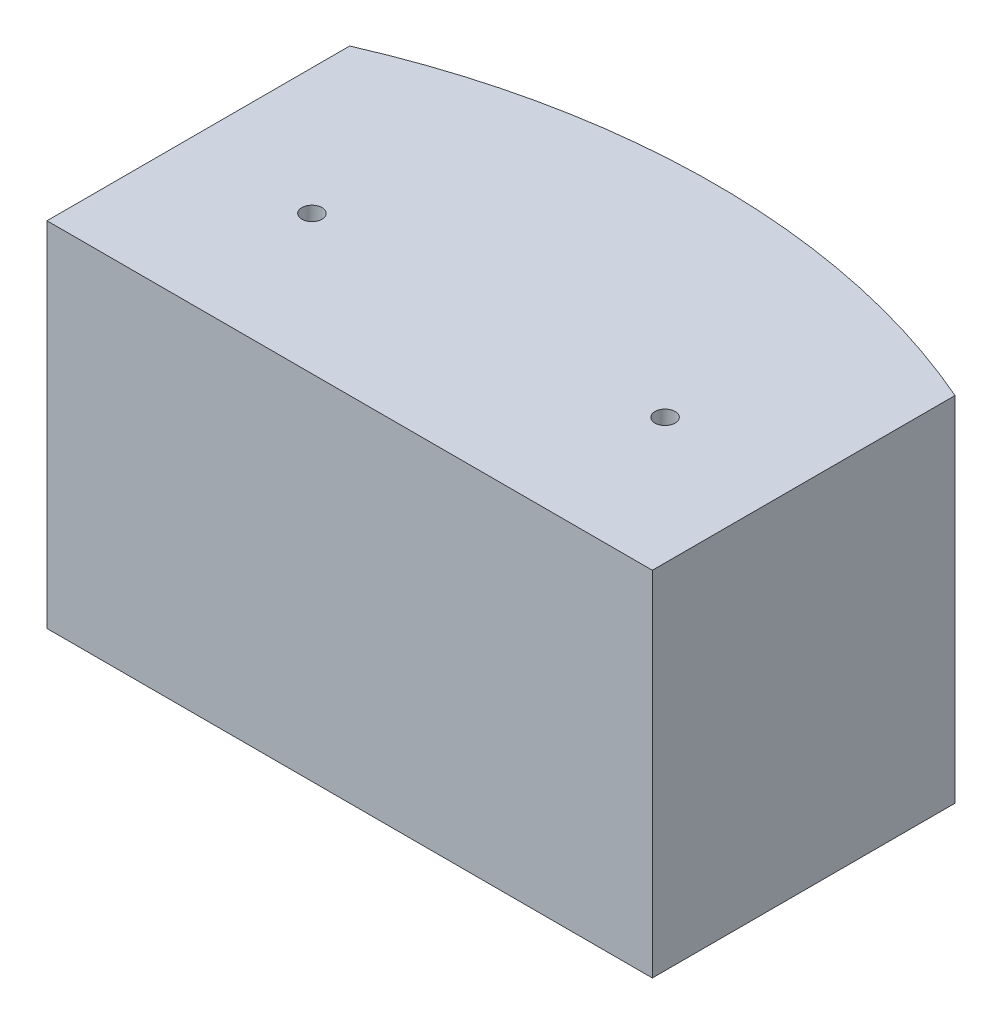
ISO-10303-21;
HEADER;
FILE_DESCRIPTION(('STEP AP214'),'2;1');
FILE_NAME('part.step','',(''),(''),'','','');
FILE_SCHEMA(('AUTOMOTIVE_DESIGN { 1 0 10303 214 1 1 1 1 }'));
ENDSEC;
DATA;
#1=APPLICATION_CONTEXT('core data for automotive mechanical design processes');
#2=APPLICATION_PROTOCOL_DEFINITION('international standard','automotive_design',2000,#1);
#3=PRODUCT_CONTEXT('',#1,'mechanical');
#4=PRODUCT('Part','Part','',(#3));
#5=PRODUCT_RELATED_PRODUCT_CATEGORY('part','',(#4));
#6=PRODUCT_DEFINITION_FORMATION('','',#4);
#7=PRODUCT_DEFINITION_CONTEXT('part definition',#1,'design');
#8=PRODUCT_DEFINITION('design','',#6,#7);
#9=PRODUCT_DEFINITION_SHAPE('','',#8);
#10=(LENGTH_UNIT() NAMED_UNIT(*) SI_UNIT(.MILLI.,.METRE.));
#11=(NAMED_UNIT(*) PLANE_ANGLE_UNIT() SI_UNIT($,.RADIAN.));
#12=(NAMED_UNIT(*) SI_UNIT($,.STERADIAN.) SOLID_ANGLE_UNIT());
#13=UNCERTAINTY_MEASURE_WITH_UNIT(LENGTH_MEASURE(1.E-05),#10,'distance_accuracy_value','');
#14=(GEOMETRIC_REPRESENTATION_CONTEXT(3) GLOBAL_UNCERTAINTY_ASSIGNED_CONTEXT((#13)) GLOBAL_UNIT_ASSIGNED_CONTEXT((#10,
#11,#12)) REPRESENTATION_CONTEXT('',''));
#15=CARTESIAN_POINT('',(0.,0.,0.));
#16=DIRECTION('',(0.,0.,1.));
#17=DIRECTION('',(1.,0.,0.));
#18=AXIS2_PLACEMENT_3D('',#15,#16,#17);
#19=CARTESIAN_POINT('',(-57.,67.,-154.477270848675));
#20=DIRECTION('',(-1.,0.,0.));
#21=DIRECTION('',(0.,0.,1.));
#22=AXIS2_PLACEMENT_3D('',#19,#20,#21);
#23=PLANE('',#22);
#24=DIRECTION('',(0.,0.,1.));
#25=VECTOR('',#24,1.);
#26=CARTESIAN_POINT('',(-57.,36.5,-150.001));
#27=LINE('',#26,#25);
#28=CARTESIAN_POINT('',(-57.,36.5,-138.747972958166));
#29=VERTEX_POINT('',#28);
#30=CARTESIAN_POINT('',(-57.,36.5,-80.4772708486752));
#31=VERTEX_POINT('',#30);
#32=EDGE_CURVE('E147',#29,#31,#27,.T.);
#33=ORIENTED_EDGE('',*,*,#32,.F.);
#34=DIRECTION('',(0.,-1.,0.));
#35=VECTOR('',#34,1.);
#36=CARTESIAN_POINT('',(-57.,70.,-138.747972958166));
#37=LINE('',#36,#35);
#38=CARTESIAN_POINT('',(-57.,67.,-138.747972958166));
#39=VERTEX_POINT('',#38);
#40=EDGE_CURVE('E195',#39,#29,#37,.T.);
#41=ORIENTED_EDGE('',*,*,#40,.F.);
#42=DIRECTION('',(0.,0.,1.));
#43=VECTOR('',#42,1.);
#44=CARTESIAN_POINT('',(-57.,67.,-154.477270848675));
#45=LINE('',#44,#43);
#46=CARTESIAN_POINT('',(-57.,67.,-80.4772708486752));
#47=VERTEX_POINT('',#46);
#48=EDGE_CURVE('E177',#39,#47,#45,.T.);
#49=ORIENTED_EDGE('',*,*,#48,.T.);
#50=DIRECTION('',(0.,1.,0.));
#51=VECTOR('',#50,1.);
#52=CARTESIAN_POINT('',(-57.,3.,-80.4772708486752));
#53=LINE('',#52,#51);
#54=EDGE_CURVE('E138',#31,#47,#53,.T.);
#55=ORIENTED_EDGE('',*,*,#54,.F.);
#56=EDGE_LOOP('',(#33,#41,#49,#55));
#57=FACE_BOUND('',#56,.T.);
#58=ADVANCED_FACE('F37',(#57),#23,.F.);
#59=DIRECTION('',(0.,0.,1.));
#60=VECTOR('',#59,1.);
#61=CARTESIAN_POINT('',(-57.,33.5,-150.001));
#62=LINE('',#61,#60);
#63=CARTESIAN_POINT('',(-57.,33.5,-138.747972958166));
#64=VERTEX_POINT('',#63);
#65=CARTESIAN_POINT('',(-57.,33.5,-80.4772708486752));
#66=VERTEX_POINT('',#65);
#67=EDGE_CURVE('E141',#64,#66,#62,.T.);
#68=ORIENTED_EDGE('',*,*,#67,.T.);
#69=CARTESIAN_POINT('',(-57.,3.,-80.4772708486752));
#70=VERTEX_POINT('',#69);
#71=EDGE_CURVE('E128',#70,#66,#53,.T.);
#72=ORIENTED_EDGE('',*,*,#71,.F.);
#73=DIRECTION('',(0.,0.,1.));
#74=VECTOR('',#73,1.);
#75=CARTESIAN_POINT('',(-57.,3.,-154.477270848675));
#76=LINE('',#75,#74);
#77=CARTESIAN_POINT('',(-57.,3.,-138.747972958166));
#78=VERTEX_POINT('',#77);
#79=EDGE_CURVE('E172',#78,#70,#76,.T.);
#80=ORIENTED_EDGE('',*,*,#79,.F.);
#81=EDGE_CURVE('E143',#64,#78,#37,.T.);
#82=ORIENTED_EDGE('',*,*,#81,.F.);
#83=EDGE_LOOP('',(#68,#72,#80,#82));
#84=FACE_BOUND('',#83,.T.);
#85=ADVANCED_FACE('F142',(#84),#23,.F.);
#86=CARTESIAN_POINT('',(57.,3.,-154.477270848675));
#87=DIRECTION('',(1.,0.,0.));
#88=DIRECTION('',(0.,0.,-1.));
#89=AXIS2_PLACEMENT_3D('',#86,#87,#88);
#90=PLANE('',#89);
#91=DIRECTION('',(0.,0.,1.));
#92=VECTOR('',#91,1.);
#93=CARTESIAN_POINT('',(57.,36.5,-150.001));
#94=LINE('',#93,#92);
#95=CARTESIAN_POINT('',(57.,36.5,-138.747972958166));
#96=VERTEX_POINT('',#95);
#97=CARTESIAN_POINT('',(57.,36.5,-80.4772708486752));
#98=VERTEX_POINT('',#97);
#99=EDGE_CURVE('E154',#96,#98,#94,.T.);
#100=ORIENTED_EDGE('',*,*,#99,.T.);
#101=DIRECTION('',(0.,1.,0.));
#102=VECTOR('',#101,1.);
#103=CARTESIAN_POINT('',(57.,3.,-80.4772708486752));
#104=LINE('',#103,#102);
#105=CARTESIAN_POINT('',(57.,67.,-80.4772708486752));
#106=VERTEX_POINT('',#105);
#107=EDGE_CURVE('E173',#98,#106,#104,.T.);
#108=ORIENTED_EDGE('',*,*,#107,.T.);
#109=DIRECTION('',(0.,0.,1.));
#110=VECTOR('',#109,1.);
#111=CARTESIAN_POINT('',(57.,67.,-154.477270848675));
#112=LINE('',#111,#110);
#113=CARTESIAN_POINT('',(57.,67.,-138.747972958166));
#114=VERTEX_POINT('',#113);
#115=EDGE_CURVE('E181',#114,#106,#112,.T.);
#116=ORIENTED_EDGE('',*,*,#115,.F.);
#117=DIRECTION('',(0.,-1.,0.));
#118=VECTOR('',#117,1.);
#119=CARTESIAN_POINT('',(57.,70.,-138.747972958166));
#120=LINE('',#119,#118);
#121=EDGE_CURVE('E52',#96,#114,#120,.F.);
#122=ORIENTED_EDGE('',*,*,#121,.F.);
#123=EDGE_LOOP('',(#100,#108,#116,#122));
#124=FACE_BOUND('',#123,.T.);
#125=ADVANCED_FACE('F257',(#124),#90,.F.);
#126=DIRECTION('',(0.,0.,1.));
#127=VECTOR('',#126,1.);
#128=CARTESIAN_POINT('',(57.,33.5,-150.001));
#129=LINE('',#128,#127);
#130=CARTESIAN_POINT('',(57.,33.5,-138.747972958166));
#131=VERTEX_POINT('',#130);
#132=CARTESIAN_POINT('',(57.,33.5,-80.4772708486752));
#133=VERTEX_POINT('',#132);
#134=EDGE_CURVE('E60',#131,#133,#129,.T.);
#135=ORIENTED_EDGE('',*,*,#134,.F.);
#136=CARTESIAN_POINT('',(57.,3.,-138.747972958166));
#137=VERTEX_POINT('',#136);
#138=EDGE_CURVE('E190',#137,#131,#120,.F.);
#139=ORIENTED_EDGE('',*,*,#138,.F.);
#140=DIRECTION('',(0.,0.,1.));
#141=VECTOR('',#140,1.);
#142=CARTESIAN_POINT('',(57.,3.,-154.477270848675));
#143=LINE('',#142,#141);
#144=CARTESIAN_POINT('',(57.,3.,-80.4772708486752));
#145=VERTEX_POINT('',#144);
#146=EDGE_CURVE('E184',#137,#145,#143,.T.);
#147=ORIENTED_EDGE('',*,*,#146,.T.);
#148=EDGE_CURVE('E170',#145,#133,#104,.T.);
#149=ORIENTED_EDGE('',*,*,#148,.T.);
#150=EDGE_LOOP('',(#135,#139,#147,#149));
#151=FACE_BOUND('',#150,.T.);
#152=ADVANCED_FACE('F360',(#151),#90,.F.);
#153=CARTESIAN_POINT('',(121.070273918565,3.,-80.4772708486752));
#154=DIRECTION('',(0.,0.,1.));
#155=DIRECTION('',(1.,0.,0.));
#156=AXIS2_PLACEMENT_3D('',#153,#154,#155);
#157=PLANE('',#156);
#158=DIRECTION('',(1.,0.,0.));
#159=VECTOR('',#158,1.);
#160=CARTESIAN_POINT('',(57.,36.5,-80.4772708486752));
#161=LINE('',#160,#159);
#162=EDGE_CURVE('E150',#31,#98,#161,.T.);
#163=ORIENTED_EDGE('',*,*,#162,.F.);
#164=ORIENTED_EDGE('',*,*,#54,.T.);
#165=DIRECTION('',(-1.,0.,0.));
#166=VECTOR('',#165,1.);
#167=CARTESIAN_POINT('',(121.070273918565,67.,-80.4772708486752));
#168=LINE('',#167,#166);
#169=EDGE_CURVE('E137',#106,#47,#168,.T.);
#170=ORIENTED_EDGE('',*,*,#169,.F.);
#171=ORIENTED_EDGE('',*,*,#107,.F.);
#172=EDGE_LOOP('',(#163,#164,#170,#171));
#173=FACE_BOUND('',#172,.T.);
#174=ADVANCED_FACE('F369',(#173),#157,.F.);
#175=DIRECTION('',(-1.,0.,0.));
#176=VECTOR('',#175,1.);
#177=CARTESIAN_POINT('',(57.,33.5,-80.4772708486752));
#178=LINE('',#177,#176);
#179=EDGE_CURVE('E133',#133,#66,#178,.T.);
#180=ORIENTED_EDGE('',*,*,#179,.F.);
#181=ORIENTED_EDGE('',*,*,#148,.F.);
#182=DIRECTION('',(-1.,0.,0.));
#183=VECTOR('',#182,1.);
#184=CARTESIAN_POINT('',(121.070273918565,3.,-80.4772708486752));
#185=LINE('',#184,#183);
#186=EDGE_CURVE('E134',#145,#70,#185,.T.);
#187=ORIENTED_EDGE('',*,*,#186,.T.);
#188=ORIENTED_EDGE('',*,*,#71,.T.);
#189=EDGE_LOOP('',(#180,#181,#187,#188));
#190=FACE_BOUND('',#189,.T.);
#191=ADVANCED_FACE('F130',(#190),#157,.F.);
#192=CARTESIAN_POINT('',(57.,67.,-154.477270848675));
#193=DIRECTION('',(0.,1.,0.));
#194=DIRECTION('',(0.,0.,1.));
#195=AXIS2_PLACEMENT_3D('',#192,#193,#194);
#196=PLANE('',#195);
#197=CARTESIAN_POINT('',(-35.,67.,-104.997270848675));
#198=DIRECTION('',(0.,1.,0.));
#199=DIRECTION('',(0.,0.,1.));
#200=AXIS2_PLACEMENT_3D('',#197,#198,#199);
#201=CIRCLE('',#200,2.);
#202=CARTESIAN_POINT('',(-35.,67.,-102.997270848675));
#203=VERTEX_POINT('',#202);
#204=EDGE_CURVE('E151',#203,#203,#201,.F.);
#205=ORIENTED_EDGE('',*,*,#204,.F.);
#206=EDGE_LOOP('',(#205));
#207=FACE_BOUND('',#206,.T.);
#208=CARTESIAN_POINT('',(35.,67.,-104.997270848675));
#209=DIRECTION('',(0.,1.,0.));
#210=DIRECTION('',(0.,0.,1.));
#211=AXIS2_PLACEMENT_3D('',#208,#209,#210);
#212=CIRCLE('',#211,2.);
#213=CARTESIAN_POINT('',(35.,67.,-102.997270848675));
#214=VERTEX_POINT('',#213);
#215=EDGE_CURVE('E454',#214,#214,#212,.F.);
#216=ORIENTED_EDGE('',*,*,#215,.F.);
#217=EDGE_LOOP('',(#216));
#218=FACE_BOUND('',#217,.T.);
#219=ORIENTED_EDGE('',*,*,#169,.T.);
#220=ORIENTED_EDGE('',*,*,#48,.F.);
#221=CARTESIAN_POINT('',(0.,67.,0.));
#222=DIRECTION('',(0.,1.,0.));
#223=DIRECTION('',(0.,0.,1.));
#224=AXIS2_PLACEMENT_3D('',#221,#222,#223);
#225=CIRCLE('',#224,150.);
#226=EDGE_CURVE('E192',#114,#39,#225,.T.);
#227=ORIENTED_EDGE('',*,*,#226,.F.);
#228=ORIENTED_EDGE('',*,*,#115,.T.);
#229=EDGE_LOOP('',(#219,#220,#227,#228));
#230=FACE_BOUND('',#229,.T.);
#231=ADVANCED_FACE('F386',(#207,#218,#230),#196,.F.);
#232=CARTESIAN_POINT('',(-57.,3.,-154.477270848675));
#233=DIRECTION('',(0.,-1.,0.));
#234=DIRECTION('',(0.,0.,-1.));
#235=AXIS2_PLACEMENT_3D('',#232,#233,#234);
#236=PLANE('',#235);
#237=ORIENTED_EDGE('',*,*,#186,.F.);
#238=ORIENTED_EDGE('',*,*,#146,.F.);
#239=CARTESIAN_POINT('',(0.,3.,0.));
#240=DIRECTION('',(0.,-1.,0.));
#241=DIRECTION('',(0.,0.,-1.));
#242=AXIS2_PLACEMENT_3D('',#239,#240,#241);
#243=CIRCLE('',#242,150.);
#244=EDGE_CURVE('E180',#78,#137,#243,.T.);
#245=ORIENTED_EDGE('',*,*,#244,.F.);
#246=ORIENTED_EDGE('',*,*,#79,.T.);
#247=EDGE_LOOP('',(#237,#238,#245,#246));
#248=FACE_BOUND('',#247,.T.);
#249=ADVANCED_FACE('F249',(#248),#236,.F.);
#250=CARTESIAN_POINT('',(0.,70.,0.));
#251=DIRECTION('',(0.,-1.,0.));
#252=DIRECTION('',(0.,0.,-1.));
#253=AXIS2_PLACEMENT_3D('',#250,#251,#252);
#254=CYLINDRICAL_SURFACE('',#253,150.);
#255=CARTESIAN_POINT('',(0.,33.5,0.));
#256=DIRECTION('',(0.,1.,0.));
#257=DIRECTION('',(0.,0.,1.));
#258=AXIS2_PLACEMENT_3D('',#255,#256,#257);
#259=CIRCLE('',#258,150.);
#260=EDGE_CURVE('E160',#64,#131,#259,.F.);
#261=ORIENTED_EDGE('',*,*,#260,.F.);
#262=ORIENTED_EDGE('',*,*,#81,.T.);
#263=ORIENTED_EDGE('',*,*,#244,.T.);
#264=ORIENTED_EDGE('',*,*,#138,.T.);
#265=EDGE_LOOP('',(#261,#262,#263,#264));
#266=FACE_BOUND('',#265,.T.);
#267=ORIENTED_EDGE('',*,*,#226,.T.);
#268=ORIENTED_EDGE('',*,*,#40,.T.);
#269=CARTESIAN_POINT('',(0.,36.5,0.));
#270=DIRECTION('',(0.,-1.,0.));
#271=DIRECTION('',(0.,0.,-1.));
#272=AXIS2_PLACEMENT_3D('',#269,#270,#271);
#273=CIRCLE('',#272,150.);
#274=EDGE_CURVE('E167',#96,#29,#273,.F.);
#275=ORIENTED_EDGE('',*,*,#274,.F.);
#276=ORIENTED_EDGE('',*,*,#121,.T.);
#277=EDGE_LOOP('',(#267,#268,#275,#276));
#278=FACE_BOUND('',#277,.T.);
#279=CARTESIAN_POINT('',(0.,0.,0.));
#280=DIRECTION('',(0.,1.,0.));
#281=DIRECTION('',(0.,0.,1.));
#282=AXIS2_PLACEMENT_3D('',#279,#280,#281);
#283=CIRCLE('',#282,150.);
#284=CARTESIAN_POINT('',(60.,0.,-137.477270848675));
#285=VERTEX_POINT('',#284);
#286=CARTESIAN_POINT('',(-60.,0.,-137.477270848675));
#287=VERTEX_POINT('',#286);
#288=EDGE_CURVE('E198',#285,#287,#283,.T.);
#289=ORIENTED_EDGE('',*,*,#288,.T.);
#290=DIRECTION('',(0.,-1.,0.));
#291=VECTOR('',#290,1.);
#292=CARTESIAN_POINT('',(-60.,70.,-137.477270848675));
#293=LINE('',#292,#291);
#294=CARTESIAN_POINT('',(-60.,70.,-137.477270848675));
#295=VERTEX_POINT('',#294);
#296=EDGE_CURVE('E11',#295,#287,#293,.T.);
#297=ORIENTED_EDGE('',*,*,#296,.F.);
#298=CARTESIAN_POINT('',(0.,70.,0.));
#299=DIRECTION('',(0.,1.,0.));
#300=DIRECTION('',(0.,0.,1.));
#301=AXIS2_PLACEMENT_3D('',#298,#299,#300);
#302=CIRCLE('',#301,150.);
#303=CARTESIAN_POINT('',(60.,70.,-137.477270848675));
#304=VERTEX_POINT('',#303);
#305=EDGE_CURVE('E199',#304,#295,#302,.T.);
#306=ORIENTED_EDGE('',*,*,#305,.F.);
#307=DIRECTION('',(0.,-1.,0.));
#308=VECTOR('',#307,1.);
#309=CARTESIAN_POINT('',(60.,70.,-137.477270848675));
#310=LINE('',#309,#308);
#311=EDGE_CURVE('E209',#304,#285,#310,.T.);
#312=ORIENTED_EDGE('',*,*,#311,.T.);
#313=EDGE_LOOP('',(#289,#297,#306,#312));
#314=FACE_BOUND('',#313,.T.);
#315=ADVANCED_FACE('F39',(#266,#278,#314),#254,.T.);
#316=CARTESIAN_POINT('',(-60.,70.,-137.477270848675));
#317=DIRECTION('',(1.,0.,0.));
#318=DIRECTION('',(0.,0.,-1.));
#319=AXIS2_PLACEMENT_3D('',#316,#317,#318);
#320=PLANE('',#319);
#321=DIRECTION('',(0.,0.,1.));
#322=VECTOR('',#321,1.);
#323=CARTESIAN_POINT('',(-60.,0.,-137.477270848675));
#324=LINE('',#323,#322);
#325=CARTESIAN_POINT('',(-60.,0.,-77.4772708486752));
#326=VERTEX_POINT('',#325);
#327=EDGE_CURVE('E212',#287,#326,#324,.T.);
#328=ORIENTED_EDGE('',*,*,#327,.T.);
#329=DIRECTION('',(0.,-1.,0.));
#330=VECTOR('',#329,1.);
#331=CARTESIAN_POINT('',(-60.,70.,-77.4772708486752));
#332=LINE('',#331,#330);
#333=CARTESIAN_POINT('',(-60.,70.,-77.4772708486752));
#334=VERTEX_POINT('',#333);
#335=EDGE_CURVE('E45',#334,#326,#332,.T.);
#336=ORIENTED_EDGE('',*,*,#335,.F.);
#337=DIRECTION('',(0.,0.,1.));
#338=VECTOR('',#337,1.);
#339=CARTESIAN_POINT('',(-60.,70.,-137.477270848675));
#340=LINE('',#339,#338);
#341=EDGE_CURVE('E202',#295,#334,#340,.T.);
#342=ORIENTED_EDGE('',*,*,#341,.F.);
#343=ORIENTED_EDGE('',*,*,#296,.T.);
#344=EDGE_LOOP('',(#328,#336,#342,#343));
#345=FACE_BOUND('',#344,.T.);
#346=ADVANCED_FACE('F242',(#345),#320,.F.);
#347=CARTESIAN_POINT('',(-60.,70.,-77.4772708486752));
#348=DIRECTION('',(0.,0.,-1.));
#349=DIRECTION('',(-1.,0.,0.));
#350=AXIS2_PLACEMENT_3D('',#347,#348,#349);
#351=PLANE('',#350);
#352=DIRECTION('',(1.,0.,0.));
#353=VECTOR('',#352,1.);
#354=CARTESIAN_POINT('',(-60.,0.,-77.4772708486752));
#355=LINE('',#354,#353);
#356=CARTESIAN_POINT('',(60.,0.,-77.4772708486752));
#357=VERTEX_POINT('',#356);
#358=EDGE_CURVE('E214',#326,#357,#355,.T.);
#359=ORIENTED_EDGE('',*,*,#358,.T.);
#360=DIRECTION('',(0.,-1.,0.));
#361=VECTOR('',#360,1.);
#362=CARTESIAN_POINT('',(60.,70.,-77.4772708486752));
#363=LINE('',#362,#361);
#364=CARTESIAN_POINT('',(60.,70.,-77.4772708486752));
#365=VERTEX_POINT('',#364);
#366=EDGE_CURVE('E219',#365,#357,#363,.T.);
#367=ORIENTED_EDGE('',*,*,#366,.F.);
#368=DIRECTION('',(1.,0.,0.));
#369=VECTOR('',#368,1.);
#370=CARTESIAN_POINT('',(-60.,70.,-77.4772708486752));
#371=LINE('',#370,#369);
#372=EDGE_CURVE('E205',#334,#365,#371,.T.);
#373=ORIENTED_EDGE('',*,*,#372,.F.);
#374=ORIENTED_EDGE('',*,*,#335,.T.);
#375=EDGE_LOOP('',(#359,#367,#373,#374));
#376=FACE_BOUND('',#375,.T.);
#377=ADVANCED_FACE('F226',(#376),#351,.F.);
#378=CARTESIAN_POINT('',(60.,70.,-137.477270848675));
#379=DIRECTION('',(-1.,0.,0.));
#380=DIRECTION('',(0.,0.,1.));
#381=AXIS2_PLACEMENT_3D('',#378,#379,#380);
#382=PLANE('',#381);
#383=DIRECTION('',(0.,0.,-1.));
#384=VECTOR('',#383,1.);
#385=CARTESIAN_POINT('',(60.,0.,-137.477270848675));
#386=LINE('',#385,#384);
#387=EDGE_CURVE('E203',#357,#285,#386,.T.);
#388=ORIENTED_EDGE('',*,*,#387,.T.);
#389=ORIENTED_EDGE('',*,*,#311,.F.);
#390=DIRECTION('',(0.,0.,-1.));
#391=VECTOR('',#390,1.);
#392=CARTESIAN_POINT('',(60.,70.,-137.477270848675));
#393=LINE('',#392,#391);
#394=EDGE_CURVE('E207',#365,#304,#393,.T.);
#395=ORIENTED_EDGE('',*,*,#394,.F.);
#396=ORIENTED_EDGE('',*,*,#366,.T.);
#397=EDGE_LOOP('',(#388,#389,#395,#396));
#398=FACE_BOUND('',#397,.T.);
#399=ADVANCED_FACE('F235',(#398),#382,.F.);
#400=CARTESIAN_POINT('',(0.,70.,0.));
#401=DIRECTION('',(0.,1.,0.));
#402=DIRECTION('',(0.,0.,1.));
#403=AXIS2_PLACEMENT_3D('',#400,#401,#402);
#404=PLANE('',#403);
#405=CARTESIAN_POINT('',(-35.,70.,-104.997270848675));
#406=DIRECTION('',(0.,1.,0.));
#407=DIRECTION('',(0.,0.,1.));
#408=AXIS2_PLACEMENT_3D('',#405,#406,#407);
#409=CIRCLE('',#408,2.);
#410=CARTESIAN_POINT('',(-35.,70.,-102.997270848675));
#411=VERTEX_POINT('',#410);
#412=EDGE_CURVE('E157',#411,#411,#409,.T.);
#413=ORIENTED_EDGE('',*,*,#412,.F.);
#414=EDGE_LOOP('',(#413));
#415=FACE_BOUND('',#414,.T.);
#416=CARTESIAN_POINT('',(35.,70.,-104.997270848675));
#417=DIRECTION('',(0.,1.,0.));
#418=DIRECTION('',(0.,0.,1.));
#419=AXIS2_PLACEMENT_3D('',#416,#417,#418);
#420=CIRCLE('',#419,2.);
#421=CARTESIAN_POINT('',(35.,70.,-102.997270848675));
#422=VERTEX_POINT('',#421);
#423=EDGE_CURVE('E455',#422,#422,#420,.T.);
#424=ORIENTED_EDGE('',*,*,#423,.F.);
#425=EDGE_LOOP('',(#424));
#426=FACE_BOUND('',#425,.T.);
#427=ORIENTED_EDGE('',*,*,#305,.T.);
#428=ORIENTED_EDGE('',*,*,#341,.T.);
#429=ORIENTED_EDGE('',*,*,#372,.T.);
#430=ORIENTED_EDGE('',*,*,#394,.T.);
#431=EDGE_LOOP('',(#427,#428,#429,#430));
#432=FACE_BOUND('',#431,.T.);
#433=ADVANCED_FACE('F241',(#415,#426,#432),#404,.T.);
#434=CARTESIAN_POINT('',(0.,0.,0.));
#435=DIRECTION('',(0.,1.,0.));
#436=DIRECTION('',(0.,0.,1.));
#437=AXIS2_PLACEMENT_3D('',#434,#435,#436);
#438=PLANE('',#437);
#439=ORIENTED_EDGE('',*,*,#288,.F.);
#440=ORIENTED_EDGE('',*,*,#387,.F.);
#441=ORIENTED_EDGE('',*,*,#358,.F.);
#442=ORIENTED_EDGE('',*,*,#327,.F.);
#443=EDGE_LOOP('',(#439,#440,#441,#442));
#444=FACE_BOUND('',#443,.T.);
#445=ADVANCED_FACE('F232',(#444),#438,.F.);
#446=CARTESIAN_POINT('',(57.,36.5,-150.001));
#447=DIRECTION('',(0.,-1.,0.));
#448=DIRECTION('',(0.,0.,-1.));
#449=AXIS2_PLACEMENT_3D('',#446,#447,#448);
#450=PLANE('',#449);
#451=ORIENTED_EDGE('',*,*,#99,.F.);
#452=ORIENTED_EDGE('',*,*,#274,.T.);
#453=ORIENTED_EDGE('',*,*,#32,.T.);
#454=ORIENTED_EDGE('',*,*,#162,.T.);
#455=EDGE_LOOP('',(#451,#452,#453,#454));
#456=FACE_BOUND('',#455,.T.);
#457=ADVANCED_FACE('F266',(#456),#450,.F.);
#458=CARTESIAN_POINT('',(57.,33.5,-150.001));
#459=DIRECTION('',(0.,1.,0.));
#460=DIRECTION('',(0.,0.,1.));
#461=AXIS2_PLACEMENT_3D('',#458,#459,#460);
#462=PLANE('',#461);
#463=ORIENTED_EDGE('',*,*,#67,.F.);
#464=ORIENTED_EDGE('',*,*,#260,.T.);
#465=ORIENTED_EDGE('',*,*,#134,.T.);
#466=ORIENTED_EDGE('',*,*,#179,.T.);
#467=EDGE_LOOP('',(#463,#464,#465,#466));
#468=FACE_BOUND('',#467,.T.);
#469=ADVANCED_FACE('F149',(#468),#462,.F.);
#470=CARTESIAN_POINT('',(35.,61.3431457505076,-104.997270848675));
#471=DIRECTION('',(0.,1.,0.));
#472=DIRECTION('',(0.,0.,1.));
#473=AXIS2_PLACEMENT_3D('',#470,#471,#472);
#474=CYLINDRICAL_SURFACE('',#473,2.);
#475=ORIENTED_EDGE('',*,*,#215,.T.);
#476=EDGE_LOOP('',(#475));
#477=FACE_BOUND('',#476,.T.);
#478=ORIENTED_EDGE('',*,*,#423,.T.);
#479=EDGE_LOOP('',(#478));
#480=FACE_BOUND('',#479,.T.);
#481=ADVANCED_FACE('F297',(#477,#480),#474,.F.);
#482=CARTESIAN_POINT('',(-35.,61.3431457505076,-104.997270848675));
#483=DIRECTION('',(0.,1.,0.));
#484=DIRECTION('',(0.,0.,1.));
#485=AXIS2_PLACEMENT_3D('',#482,#483,#484);
#486=CYLINDRICAL_SURFACE('',#485,2.);
#487=ORIENTED_EDGE('',*,*,#204,.T.);
#488=EDGE_LOOP('',(#487));
#489=FACE_BOUND('',#488,.T.);
#490=ORIENTED_EDGE('',*,*,#412,.T.);
#491=EDGE_LOOP('',(#490));
#492=FACE_BOUND('',#491,.T.);
#493=ADVANCED_FACE('F303',(#489,#492),#486,.F.);
#494=CLOSED_SHELL('',(#58,#85,#125,#152,#174,#191,#231,#249,#315,#346,#377,#399,#433,#445,#457,
#469,#481,#493));
#495=MANIFOLD_SOLID_BREP('B2',#494);
#496=ADVANCED_BREP_SHAPE_REPRESENTATION('',(#18,#495),#14);
#497=SHAPE_DEFINITION_REPRESENTATION(#9,#496);
ENDSEC;
END-ISO-10303-21;
